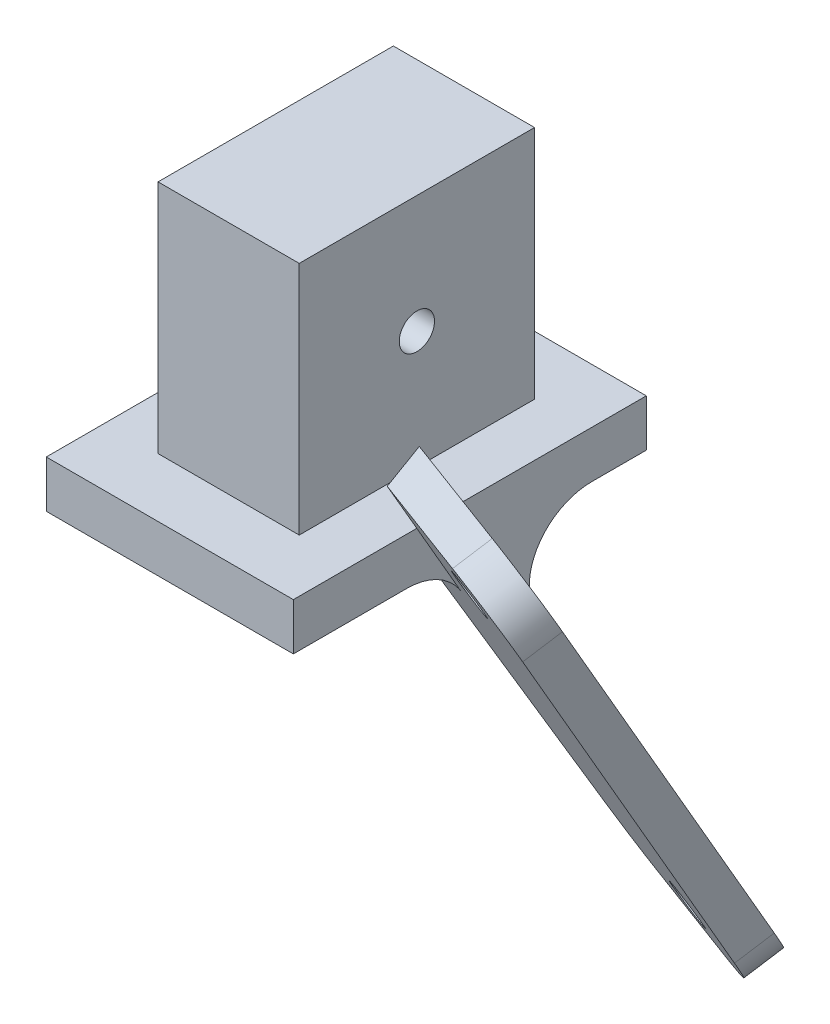
ISO-10303-21;
HEADER;
FILE_DESCRIPTION(('STEP AP214'),'2;1');
FILE_NAME('part.step','',(''),(''),'','','');
FILE_SCHEMA(('AUTOMOTIVE_DESIGN { 1 0 10303 214 1 1 1 1 }'));
ENDSEC;
DATA;
#1=APPLICATION_CONTEXT('core data for automotive mechanical design processes');
#2=APPLICATION_PROTOCOL_DEFINITION('international standard','automotive_design',2000,#1);
#3=PRODUCT_CONTEXT('',#1,'mechanical');
#4=PRODUCT('Part','Part','',(#3));
#5=PRODUCT_RELATED_PRODUCT_CATEGORY('part','',(#4));
#6=PRODUCT_DEFINITION_FORMATION('','',#4);
#7=PRODUCT_DEFINITION_CONTEXT('part definition',#1,'design');
#8=PRODUCT_DEFINITION('design','',#6,#7);
#9=PRODUCT_DEFINITION_SHAPE('','',#8);
#10=(LENGTH_UNIT() NAMED_UNIT(*) SI_UNIT(.MILLI.,.METRE.));
#11=(NAMED_UNIT(*) PLANE_ANGLE_UNIT() SI_UNIT($,.RADIAN.));
#12=(NAMED_UNIT(*) SI_UNIT($,.STERADIAN.) SOLID_ANGLE_UNIT());
#13=UNCERTAINTY_MEASURE_WITH_UNIT(LENGTH_MEASURE(1.E-05),#10,'distance_accuracy_value','');
#14=(GEOMETRIC_REPRESENTATION_CONTEXT(3) GLOBAL_UNCERTAINTY_ASSIGNED_CONTEXT((#13)) GLOBAL_UNIT_ASSIGNED_CONTEXT((#10,
#11,#12)) REPRESENTATION_CONTEXT('',''));
#15=CARTESIAN_POINT('',(0.,0.,0.));
#16=DIRECTION('',(0.,0.,1.));
#17=DIRECTION('',(1.,0.,0.));
#18=AXIS2_PLACEMENT_3D('',#15,#16,#17);
#19=CARTESIAN_POINT('',(0.,0.,0.));
#20=DIRECTION('',(0.,1.,0.));
#21=DIRECTION('',(0.,0.,1.));
#22=AXIS2_PLACEMENT_3D('',#19,#20,#21);
#23=PLANE('',#22);
#24=DIRECTION('',(0.,0.,-1.));
#25=VECTOR('',#24,1.);
#26=CARTESIAN_POINT('',(21.,0.,0.));
#27=LINE('',#26,#25);
#28=CARTESIAN_POINT('',(21.,0.,4.62668487913654));
#29=VERTEX_POINT('',#28);
#30=CARTESIAN_POINT('',(21.,0.,0.));
#31=VERTEX_POINT('',#30);
#32=EDGE_CURVE('E341',#29,#31,#27,.T.);
#33=ORIENTED_EDGE('',*,*,#32,.F.);
#34=DIRECTION('',(0.939692620785907,0.,0.342020143325673));
#35=VECTOR('',#34,1.);
#36=CARTESIAN_POINT('',(10.2155863177674,0.,0.701479304790655));
#37=LINE('',#36,#35);
#38=CARTESIAN_POINT('',(8.28828776764039,0.,0.));
#39=VERTEX_POINT('',#38);
#40=EDGE_CURVE('E423',#29,#39,#37,.F.);
#41=ORIENTED_EDGE('',*,*,#40,.T.);
#42=DIRECTION('',(-1.,0.,0.));
#43=VECTOR('',#42,1.);
#44=CARTESIAN_POINT('',(0.,0.,0.));
#45=LINE('',#44,#43);
#46=EDGE_CURVE('E329',#31,#39,#45,.T.);
#47=ORIENTED_EDGE('',*,*,#46,.F.);
#48=EDGE_LOOP('',(#33,#41,#47));
#49=FACE_BOUND('',#48,.T.);
#50=ADVANCED_FACE('F57',(#49),#23,.F.);
#51=CARTESIAN_POINT('',(21.9018797354497,9.78209952844713,19.5429186044547));
#52=DIRECTION('',(0.,-0.866025403784436,-0.500000000000004));
#53=DIRECTION('',(0.,0.500000000000004,-0.866025403784436));
#54=AXIS2_PLACEMENT_3D('',#51,#52,#53);
#55=PLANE('',#54);
#56=DIRECTION('',(0.953741925422946,-0.150313289241614,0.260350254019269));
#57=VECTOR('',#56,1.);
#58=CARTESIAN_POINT('',(21.,8.3514866403127,22.0208128126663));
#59=LINE('',#58,#57);
#60=CARTESIAN_POINT('',(21.,8.3514866403127,22.0208128126663));
#61=VERTEX_POINT('',#60);
#62=CARTESIAN_POINT('',(28.6299354033836,7.14898032637979,24.1036148448205));
#63=VERTEX_POINT('',#62);
#64=EDGE_CURVE('E252',#61,#63,#59,.T.);
#65=ORIENTED_EDGE('',*,*,#64,.T.);
#66=DIRECTION('',(-0.300626578483225,-0.476870962711477,0.825964736070553));
#67=VECTOR('',#66,1.);
#68=CARTESIAN_POINT('',(29.5318151388332,8.57959321451422,21.6257206366088));
#69=LINE('',#68,#67);
#70=CARTESIAN_POINT('',(29.5318151388332,8.57959321451422,21.6257206366088));
#71=VERTEX_POINT('',#70);
#72=EDGE_CURVE('E410',#63,#71,#69,.F.);
#73=ORIENTED_EDGE('',*,*,#72,.T.);
#74=DIRECTION('',(0.953741925422946,-0.150313289241614,0.260350254019269));
#75=VECTOR('',#74,1.);
#76=CARTESIAN_POINT('',(21.9018797354497,9.78209952844713,19.5429186044547));
#77=LINE('',#76,#75);
#78=CARTESIAN_POINT('',(21.,9.92423914286712,19.296725570511));
#79=VERTEX_POINT('',#78);
#80=EDGE_CURVE('E639',#79,#71,#77,.T.);
#81=ORIENTED_EDGE('',*,*,#80,.F.);
#82=DIRECTION('',(0.,0.500000000000004,-0.866025403784436));
#83=VECTOR('',#82,1.);
#84=CARTESIAN_POINT('',(21.,9.78209952844713,19.5429186044547));
#85=LINE('',#84,#83);
#86=EDGE_CURVE('E244',#61,#79,#85,.T.);
#87=ORIENTED_EDGE('',*,*,#86,.F.);
#88=EDGE_LOOP('',(#65,#73,#81,#87));
#89=FACE_BOUND('',#88,.T.);
#90=ADVANCED_FACE('F479',(#89),#55,.F.);
#91=CARTESIAN_POINT('',(-1.47086821116475,-2.33317474262836,4.04117719716872));
#92=DIRECTION('',(-0.300626578483225,-0.476870962711477,0.825964736070553));
#93=DIRECTION('',(0.,-0.866025403784436,-0.500000000000004));
#94=AXIS2_PLACEMENT_3D('',#91,#92,#93);
#95=PLANE('',#94);
#96=CARTESIAN_POINT('',(28.1012022506988,4.47493612945445,18.7351952555799));
#97=DIRECTION('',(-0.300626578483225,-0.476870962711477,0.825964736070553));
#98=DIRECTION('',(0.,-0.866025403784436,-0.500000000000004));
#99=AXIS2_PLACEMENT_3D('',#96,#97,#98);
#100=CIRCLE('',#99,1.8);
#101=CARTESIAN_POINT('',(28.1012022506988,2.91609040264247,17.8351952555799));
#102=VERTEX_POINT('',#101);
#103=EDGE_CURVE('E616',#102,#102,#100,.T.);
#104=ORIENTED_EDGE('',*,*,#103,.T.);
#105=EDGE_LOOP('',(#104));
#106=FACE_BOUND('',#105,.T.);
#107=CARTESIAN_POINT('',(28.1012022506988,-27.5680038105697,0.23519525557973));
#108=DIRECTION('',(-0.300626578483225,-0.476870962711477,0.825964736070553));
#109=DIRECTION('',(0.,-0.866025403784436,-0.500000000000004));
#110=AXIS2_PLACEMENT_3D('',#107,#108,#109);
#111=CIRCLE('',#110,1.8);
#112=CARTESIAN_POINT('',(28.1012022506988,-29.1268495373817,-0.664804744420277));
#113=VERTEX_POINT('',#112);
#114=EDGE_CURVE('E245',#113,#113,#111,.T.);
#115=ORIENTED_EDGE('',*,*,#114,.T.);
#116=EDGE_LOOP('',(#115));
#117=FACE_BOUND('',#116,.T.);
#118=CARTESIAN_POINT('',(12.1109458051018,-6.70516727500118,6.46038216096881));
#119=DIRECTION('',(-0.300626578483225,-0.476870962711477,0.825964736070553));
#120=DIRECTION('',(0.,-0.866025403784436,-0.500000000000004));
#121=AXIS2_PLACEMENT_3D('',#118,#119,#120);
#122=CIRCLE('',#121,5.);
#123=CARTESIAN_POINT('',(7.84568224862732,-7.96943748277321,4.17802644032607));
#124=VERTEX_POINT('',#123);
#125=CARTESIAN_POINT('',(7.59495621370452,-7.38435481355739,4.42456726322852));
#126=VERTEX_POINT('',#125);
#127=EDGE_CURVE('E392',#124,#126,#122,.F.);
#128=ORIENTED_EDGE('',*,*,#127,.T.);
#129=DIRECTION('',(0.939692620785907,0.,0.342020143325673));
#130=VECTOR('',#129,1.);
#131=CARTESIAN_POINT('',(22.3702172473642,-7.38435481355739,9.80232248299399));
#132=LINE('',#131,#130);
#133=CARTESIAN_POINT('',(21.,-7.38435481355739,9.30360419047525));
#134=VERTEX_POINT('',#133);
#135=EDGE_CURVE('E413',#126,#134,#132,.T.);
#136=ORIENTED_EDGE('',*,*,#135,.T.);
#137=DIRECTION('',(0.,0.866025403784436,0.500000000000004));
#138=VECTOR('',#137,1.);
#139=CARTESIAN_POINT('',(21.,-2.87466749124288,11.9072733799746));
#140=LINE('',#139,#138);
#141=CARTESIAN_POINT('',(21.,4.,15.8763645066329));
#142=VERTEX_POINT('',#141);
#143=EDGE_CURVE('E260',#134,#142,#140,.T.);
#144=ORIENTED_EDGE('',*,*,#143,.T.);
#145=DIRECTION('',(0.,-0.866025403784436,-0.500000000000004));
#146=VECTOR('',#145,1.);
#147=CARTESIAN_POINT('',(21.,-5.87466749124286,10.1752225724057));
#148=LINE('',#147,#146);
#149=EDGE_CURVE('E242',#79,#142,#148,.T.);
#150=ORIENTED_EDGE('',*,*,#149,.F.);
#151=ORIENTED_EDGE('',*,*,#80,.T.);
#152=CARTESIAN_POINT('',(29.5318151388332,4.24946619559204,19.1257206366088));
#153=DIRECTION('',(-0.300626578483225,-0.476870962711477,0.825964736070553));
#154=DIRECTION('',(0.,-0.866025403784436,-0.500000000000004));
#155=AXIS2_PLACEMENT_3D('',#152,#153,#154);
#156=CIRCLE('',#155,5.);
#157=CARTESIAN_POINT('',(34.300524765948,3.49789974938397,20.4274719067051));
#158=VERTEX_POINT('',#157);
#159=EDGE_CURVE('E383',#71,#158,#156,.F.);
#160=ORIENTED_EDGE('',*,*,#159,.T.);
#161=DIRECTION('',(0.,-0.866025403784436,-0.500000000000004));
#162=VECTOR('',#161,1.);
#163=CARTESIAN_POINT('',(34.300524765948,7.82802676830616,22.9274719067051));
#164=LINE('',#163,#162);
#165=CARTESIAN_POINT('',(34.300524765948,-27.6790147868557,2.42747190670498));
#166=VERTEX_POINT('',#165);
#167=EDGE_CURVE('E268',#158,#166,#164,.T.);
#168=ORIENTED_EDGE('',*,*,#167,.T.);
#169=CARTESIAN_POINT('',(29.5318151388332,-26.9274483406477,1.12572063660863));
#170=DIRECTION('',(-0.300626578483225,-0.476870962711477,0.825964736070553));
#171=DIRECTION('',(0.,-0.866025403784436,-0.500000000000004));
#172=AXIS2_PLACEMENT_3D('',#169,#170,#171);
#173=CIRCLE('',#172,5.);
#174=CARTESIAN_POINT('',(29.5318151388332,-31.2575753595698,-1.37427936339139));
#175=VERTEX_POINT('',#174);
#176=EDGE_CURVE('E386',#166,#175,#173,.F.);
#177=ORIENTED_EDGE('',*,*,#176,.T.);
#178=DIRECTION('',(-0.953741925422946,0.150313289241614,-0.260350254019268));
#179=VECTOR('',#178,1.);
#180=CARTESIAN_POINT('',(34.300524765948,-32.0091418057779,-0.0725280932950454));
#181=LINE('',#180,#179);
#182=CARTESIAN_POINT('',(21.7343639150982,-30.0286679267537,-3.50280947482801));
#183=VERTEX_POINT('',#182);
#184=EDGE_CURVE('E261',#175,#183,#181,.T.);
#185=ORIENTED_EDGE('',*,*,#184,.T.);
#186=CARTESIAN_POINT('',(21.7343639150982,-25.6985409078315,-1.00280947482799));
#187=DIRECTION('',(-0.300626578483225,-0.476870962711477,0.825964736070553));
#188=DIRECTION('',(0.,-0.866025403784436,-0.500000000000004));
#189=AXIS2_PLACEMENT_3D('',#186,#187,#188);
#190=CIRCLE('',#189,5.);
#191=CARTESIAN_POINT('',(17.4691003586237,-26.9628111156035,-3.28516519547073));
#192=VERTEX_POINT('',#191);
#193=EDGE_CURVE('E389',#183,#192,#190,.F.);
#194=ORIENTED_EDGE('',*,*,#193,.T.);
#195=DIRECTION('',(-0.426526355647448,0.841818815774649,0.330781422310677));
#196=VECTOR('',#195,1.);
#197=CARTESIAN_POINT('',(4.14633422216601,-0.668175242959792,7.04695959208309));
#198=LINE('',#197,#196);
#199=EDGE_CURVE('E518',#192,#124,#198,.T.);
#200=ORIENTED_EDGE('',*,*,#199,.T.);
#201=EDGE_LOOP('',(#128,#136,#144,#150,#151,#160,#168,#177,#185,#194,#200));
#202=FACE_BOUND('',#201,.T.);
#203=ADVANCED_FACE('F486',(#106,#117,#202),#95,.F.);
#204=CARTESIAN_POINT('',(-2.37274794661443,-3.76378763076279,6.51907140538038));
#205=DIRECTION('',(-0.300626578483225,-0.476870962711477,0.825964736070553));
#206=DIRECTION('',(0.,-0.866025403784436,-0.500000000000004));
#207=AXIS2_PLACEMENT_3D('',#204,#205,#206);
#208=PLANE('',#207);
#209=DIRECTION('',(0.,0.866025403784436,0.500000000000004));
#210=VECTOR('',#209,1.);
#211=CARTESIAN_POINT('',(21.,-4.4474199937973,14.6313606221299));
#212=LINE('',#211,#210);
#213=CARTESIAN_POINT('',(21.,-2.61564518644262,15.6889363002509));
#214=VERTEX_POINT('',#213);
#215=CARTESIAN_POINT('',(21.,4.,19.5084808295067));
#216=VERTEX_POINT('',#215);
#217=EDGE_CURVE('E250',#214,#216,#212,.T.);
#218=ORIENTED_EDGE('',*,*,#217,.F.);
#219=DIRECTION('',(0.939692620785907,0.,0.342020143325673));
#220=VECTOR('',#219,1.);
#221=CARTESIAN_POINT('',(-2.5857935842306,-2.61564518644261,7.10440948404412));
#222=LINE('',#221,#220);
#223=CARTESIAN_POINT('',(5.47377114117365,-2.61564518644261,10.0378511452332));
#224=VERTEX_POINT('',#223);
#225=EDGE_CURVE('E83',#214,#224,#222,.F.);
#226=ORIENTED_EDGE('',*,*,#225,.T.);
#227=CARTESIAN_POINT('',(1.67164681542267,-5.,7.27738317022939));
#228=DIRECTION('',(-0.300626578483225,-0.476870962711477,0.825964736070553));
#229=DIRECTION('',(0.,0.866025403784436,0.500000000000004));
#230=AXIS2_PLACEMENT_3D('',#227,#228,#229);
#231=ELLIPSE('',#230,5.70790654874848,5.);
#232=CARTESIAN_POINT('',(6.4403564425374,-5.75156644620807,8.57913444032573));
#233=VERTEX_POINT('',#232);
#234=EDGE_CURVE('E67',#224,#233,#231,.F.);
#235=ORIENTED_EDGE('',*,*,#234,.T.);
#236=DIRECTION('',(0.,0.866025403784436,0.500000000000004));
#237=VECTOR('',#236,1.);
#238=CARTESIAN_POINT('',(6.4403564425374,10.6461408386559,18.0463551553347));
#239=LINE('',#238,#237);
#240=CARTESIAN_POINT('',(6.4403564425374,-7.38421371692753,7.63652509908413));
#241=VERTEX_POINT('',#240);
#242=EDGE_CURVE('E271',#241,#233,#239,.T.);
#243=ORIENTED_EDGE('',*,*,#242,.F.);
#244=CARTESIAN_POINT('',(11.2090660696521,-8.13578016313561,8.93827636918047));
#245=DIRECTION('',(-0.300626578483225,-0.476870962711477,0.825964736070553));
#246=DIRECTION('',(0.,-0.866025403784436,-0.500000000000004));
#247=AXIS2_PLACEMENT_3D('',#244,#245,#246);
#248=CIRCLE('',#247,5.);
#249=CARTESIAN_POINT('',(6.94380251317764,-9.40005037090764,6.65592064853773));
#250=VERTEX_POINT('',#249);
#251=EDGE_CURVE('E373',#241,#250,#248,.T.);
#252=ORIENTED_EDGE('',*,*,#251,.T.);
#253=DIRECTION('',(-0.426526355647448,0.841818815774649,0.330781422310677));
#254=VECTOR('',#253,1.);
#255=CARTESIAN_POINT('',(3.24445448671633,-2.09878813109422,9.52485380029475));
#256=LINE('',#255,#254);
#257=CARTESIAN_POINT('',(16.567220623174,-28.3934240037379,-0.80727098725907));
#258=VERTEX_POINT('',#257);
#259=EDGE_CURVE('E523',#258,#250,#256,.T.);
#260=ORIENTED_EDGE('',*,*,#259,.F.);
#261=CARTESIAN_POINT('',(20.8324841796485,-27.1291537959659,1.47508473338367));
#262=DIRECTION('',(-0.300626578483225,-0.476870962711477,0.825964736070553));
#263=DIRECTION('',(0.,-0.866025403784436,-0.500000000000004));
#264=AXIS2_PLACEMENT_3D('',#261,#262,#263);
#265=CIRCLE('',#264,5.);
#266=CARTESIAN_POINT('',(20.8324841796485,-31.4592808148881,-1.02491526661635));
#267=VERTEX_POINT('',#266);
#268=EDGE_CURVE('E370',#258,#267,#265,.T.);
#269=ORIENTED_EDGE('',*,*,#268,.T.);
#270=DIRECTION('',(-0.953741925422946,0.150313289241614,-0.260350254019269));
#271=VECTOR('',#270,1.);
#272=CARTESIAN_POINT('',(6.44035644253739,-29.1910277354282,-4.95364484466546));
#273=LINE('',#272,#271);
#274=CARTESIAN_POINT('',(28.6299354033836,-32.6881882477043,1.10361484482027));
#275=VERTEX_POINT('',#274);
#276=EDGE_CURVE('E651',#275,#267,#273,.T.);
#277=ORIENTED_EDGE('',*,*,#276,.F.);
#278=CARTESIAN_POINT('',(28.6299354033836,-28.3580612287821,3.60361484482029));
#279=DIRECTION('',(-0.300626578483225,-0.476870962711477,0.825964736070553));
#280=DIRECTION('',(0.,-0.866025403784436,-0.500000000000004));
#281=AXIS2_PLACEMENT_3D('',#278,#279,#280);
#282=CIRCLE('',#281,5.);
#283=CARTESIAN_POINT('',(33.3986450304983,-29.1096276749902,4.90536611491663));
#284=VERTEX_POINT('',#283);
#285=EDGE_CURVE('E367',#275,#284,#282,.T.);
#286=ORIENTED_EDGE('',*,*,#285,.T.);
#287=DIRECTION('',(0.,-0.866025403784436,-0.500000000000004));
#288=VECTOR('',#287,1.);
#289=CARTESIAN_POINT('',(33.3986450304983,6.39741388017172,25.4053661149168));
#290=LINE('',#289,#288);
#291=CARTESIAN_POINT('',(33.3986450304983,2.06728686124954,22.9053661149168));
#292=VERTEX_POINT('',#291);
#293=EDGE_CURVE('E648',#292,#284,#290,.T.);
#294=ORIENTED_EDGE('',*,*,#293,.F.);
#295=CARTESIAN_POINT('',(28.6299354033836,2.81885330745761,21.6036148448204));
#296=DIRECTION('',(-0.300626578483225,-0.476870962711477,0.825964736070553));
#297=DIRECTION('',(0.,-0.866025403784436,-0.500000000000004));
#298=AXIS2_PLACEMENT_3D('',#295,#296,#297);
#299=CIRCLE('',#298,5.);
#300=EDGE_CURVE('E364',#292,#63,#299,.T.);
#301=ORIENTED_EDGE('',*,*,#300,.T.);
#302=ORIENTED_EDGE('',*,*,#64,.F.);
#303=DIRECTION('',(0.,-0.866025403784436,-0.500000000000004));
#304=VECTOR('',#303,1.);
#305=CARTESIAN_POINT('',(21.,-7.44741999379728,12.899309814561));
#306=LINE('',#305,#304);
#307=EDGE_CURVE('E239',#61,#216,#306,.T.);
#308=ORIENTED_EDGE('',*,*,#307,.T.);
#309=EDGE_LOOP('',(#218,#226,#235,#243,#252,#260,#269,#277,#286,#294,#301,#302,#308));
#310=FACE_BOUND('',#309,.T.);
#311=CARTESIAN_POINT('',(27.1993225152491,3.04432324132002,21.2130894637916));
#312=DIRECTION('',(-0.300626578483225,-0.476870962711477,0.825964736070553));
#313=DIRECTION('',(0.,-0.866025403784436,-0.500000000000004));
#314=AXIS2_PLACEMENT_3D('',#311,#312,#313);
#315=CIRCLE('',#314,1.8);
#316=CARTESIAN_POINT('',(27.1993225152491,1.48547751450804,20.3130894637915));
#317=VERTEX_POINT('',#316);
#318=EDGE_CURVE('E619',#317,#317,#315,.T.);
#319=ORIENTED_EDGE('',*,*,#318,.F.);
#320=EDGE_LOOP('',(#319));
#321=FACE_BOUND('',#320,.T.);
#322=CARTESIAN_POINT('',(27.1993225152491,-28.9986166987041,2.71308946379139));
#323=DIRECTION('',(-0.300626578483225,-0.476870962711477,0.825964736070553));
#324=DIRECTION('',(0.,-0.866025403784436,-0.500000000000004));
#325=AXIS2_PLACEMENT_3D('',#322,#323,#324);
#326=CIRCLE('',#325,1.8);
#327=CARTESIAN_POINT('',(27.1993225152491,-30.5574624255161,1.81308946379138));
#328=VERTEX_POINT('',#327);
#329=EDGE_CURVE('E621',#328,#328,#326,.T.);
#330=ORIENTED_EDGE('',*,*,#329,.F.);
#331=EDGE_LOOP('',(#330));
#332=FACE_BOUND('',#331,.T.);
#333=ADVANCED_FACE('F248',(#310,#321,#332),#208,.T.);
#334=CARTESIAN_POINT('',(21.,4.,0.));
#335=DIRECTION('',(-1.,0.,0.));
#336=DIRECTION('',(0.,0.,1.));
#337=AXIS2_PLACEMENT_3D('',#334,#335,#336);
#338=PLANE('',#337);
#339=ORIENTED_EDGE('',*,*,#143,.F.);
#340=CARTESIAN_POINT('',(21.,-5.,4.62668487913654));
#341=DIRECTION('',(-1.,0.,0.));
#342=DIRECTION('',(0.,0.,-1.));
#343=AXIS2_PLACEMENT_3D('',#340,#341,#342);
#344=ELLIPSE('',#343,5.32088886237957,5.);
#345=EDGE_CURVE('E431',#134,#29,#344,.T.);
#346=ORIENTED_EDGE('',*,*,#345,.T.);
#347=ORIENTED_EDGE('',*,*,#32,.T.);
#348=DIRECTION('',(0.,-1.,0.));
#349=VECTOR('',#348,1.);
#350=CARTESIAN_POINT('',(21.,4.,0.));
#351=LINE('',#350,#349);
#352=CARTESIAN_POINT('',(21.,4.,0.));
#353=VERTEX_POINT('',#352);
#354=EDGE_CURVE('E352',#353,#31,#351,.T.);
#355=ORIENTED_EDGE('',*,*,#354,.F.);
#356=DIRECTION('',(0.,0.,-1.));
#357=VECTOR('',#356,1.);
#358=CARTESIAN_POINT('',(21.,4.,0.));
#359=LINE('',#358,#357);
#360=EDGE_CURVE('E234',#142,#353,#359,.T.);
#361=ORIENTED_EDGE('',*,*,#360,.F.);
#362=EDGE_LOOP('',(#339,#346,#347,#355,#361));
#363=FACE_BOUND('',#362,.T.);
#364=ADVANCED_FACE('F501',(#363),#338,.F.);
#365=CARTESIAN_POINT('',(0.,4.,0.));
#366=DIRECTION('',(0.,1.,0.));
#367=DIRECTION('',(0.,0.,1.));
#368=AXIS2_PLACEMENT_3D('',#365,#366,#367);
#369=PLANE('',#368);
#370=DIRECTION('',(-1.,0.,0.));
#371=VECTOR('',#370,1.);
#372=CARTESIAN_POINT('',(4.5,4.,5.));
#373=LINE('',#372,#371);
#374=CARTESIAN_POINT('',(16.5,4.,5.));
#375=VERTEX_POINT('',#374);
#376=CARTESIAN_POINT('',(4.5,4.,5.));
#377=VERTEX_POINT('',#376);
#378=EDGE_CURVE('E287',#375,#377,#373,.T.);
#379=ORIENTED_EDGE('',*,*,#378,.F.);
#380=DIRECTION('',(0.,0.,-1.));
#381=VECTOR('',#380,1.);
#382=CARTESIAN_POINT('',(16.5,4.,5.));
#383=LINE('',#382,#381);
#384=CARTESIAN_POINT('',(16.5,4.,25.));
#385=VERTEX_POINT('',#384);
#386=EDGE_CURVE('E304',#385,#375,#383,.T.);
#387=ORIENTED_EDGE('',*,*,#386,.F.);
#388=DIRECTION('',(1.,0.,0.));
#389=VECTOR('',#388,1.);
#390=CARTESIAN_POINT('',(4.5,4.,25.));
#391=LINE('',#390,#389);
#392=CARTESIAN_POINT('',(4.5,4.,25.));
#393=VERTEX_POINT('',#392);
#394=EDGE_CURVE('E300',#393,#385,#391,.T.);
#395=ORIENTED_EDGE('',*,*,#394,.F.);
#396=DIRECTION('',(0.,0.,1.));
#397=VECTOR('',#396,1.);
#398=CARTESIAN_POINT('',(4.5,4.,5.));
#399=LINE('',#398,#397);
#400=EDGE_CURVE('E278',#377,#393,#399,.T.);
#401=ORIENTED_EDGE('',*,*,#400,.F.);
#402=EDGE_LOOP('',(#379,#387,#395,#401));
#403=FACE_BOUND('',#402,.T.);
#404=ORIENTED_EDGE('',*,*,#360,.T.);
#405=DIRECTION('',(-1.,0.,0.));
#406=VECTOR('',#405,1.);
#407=CARTESIAN_POINT('',(0.,4.,0.));
#408=LINE('',#407,#406);
#409=CARTESIAN_POINT('',(0.,4.,0.));
#410=VERTEX_POINT('',#409);
#411=EDGE_CURVE('E233',#353,#410,#408,.T.);
#412=ORIENTED_EDGE('',*,*,#411,.T.);
#413=DIRECTION('',(0.,0.,1.));
#414=VECTOR('',#413,1.);
#415=CARTESIAN_POINT('',(0.,4.,0.));
#416=LINE('',#415,#414);
#417=CARTESIAN_POINT('',(0.,4.,30.));
#418=VERTEX_POINT('',#417);
#419=EDGE_CURVE('E326',#410,#418,#416,.T.);
#420=ORIENTED_EDGE('',*,*,#419,.T.);
#421=DIRECTION('',(1.,0.,0.));
#422=VECTOR('',#421,1.);
#423=CARTESIAN_POINT('',(0.,4.,30.));
#424=LINE('',#423,#422);
#425=CARTESIAN_POINT('',(21.,4.,30.));
#426=VERTEX_POINT('',#425);
#427=EDGE_CURVE('E227',#418,#426,#424,.T.);
#428=ORIENTED_EDGE('',*,*,#427,.T.);
#429=EDGE_CURVE('E221',#426,#216,#359,.T.);
#430=ORIENTED_EDGE('',*,*,#429,.T.);
#431=DIRECTION('',(0.,0.,-1.));
#432=VECTOR('',#431,1.);
#433=CARTESIAN_POINT('',(21.,4.,23.5414123331734));
#434=LINE('',#433,#432);
#435=EDGE_CURVE('E224',#216,#142,#434,.T.);
#436=ORIENTED_EDGE('',*,*,#435,.T.);
#437=EDGE_LOOP('',(#404,#412,#420,#428,#430,#436));
#438=FACE_BOUND('',#437,.T.);
#439=ADVANCED_FACE('F223',(#403,#438),#369,.T.);
#440=CARTESIAN_POINT('',(3.65820995840766,0.,0.));
#441=VERTEX_POINT('',#440);
#442=CARTESIAN_POINT('',(0.,0.,0.));
#443=VERTEX_POINT('',#442);
#444=EDGE_CURVE('E345',#441,#443,#45,.T.);
#445=ORIENTED_EDGE('',*,*,#444,.F.);
#446=DIRECTION('',(0.263342239326904,0.,-0.964702474852372));
#447=VECTOR('',#446,1.);
#448=CARTESIAN_POINT('',(0.828041260088058,0.,10.3677661225071));
#449=LINE('',#448,#447);
#450=CARTESIAN_POINT('',(0.16851392300654,0.,12.7838147440331));
#451=VERTEX_POINT('',#450);
#452=EDGE_CURVE('E420',#441,#451,#449,.F.);
#453=ORIENTED_EDGE('',*,*,#452,.T.);
#454=DIRECTION('',(0.939692620785907,0.,0.342020143325673));
#455=VECTOR('',#454,1.);
#456=CARTESIAN_POINT('',(-4.08892647664673,0.,11.2342331643969));
#457=LINE('',#456,#455);
#458=CARTESIAN_POINT('',(21.,0.,20.3658556115896));
#459=VERTEX_POINT('',#458);
#460=EDGE_CURVE('E417',#451,#459,#457,.T.);
#461=ORIENTED_EDGE('',*,*,#460,.T.);
#462=CARTESIAN_POINT('',(21.,0.,30.));
#463=VERTEX_POINT('',#462);
#464=EDGE_CURVE('E342',#463,#459,#27,.T.);
#465=ORIENTED_EDGE('',*,*,#464,.F.);
#466=DIRECTION('',(1.,0.,0.));
#467=VECTOR('',#466,1.);
#468=CARTESIAN_POINT('',(0.,0.,30.));
#469=LINE('',#468,#467);
#470=CARTESIAN_POINT('',(0.,0.,30.));
#471=VERTEX_POINT('',#470);
#472=EDGE_CURVE('E338',#471,#463,#469,.T.);
#473=ORIENTED_EDGE('',*,*,#472,.F.);
#474=DIRECTION('',(0.,0.,1.));
#475=VECTOR('',#474,1.);
#476=CARTESIAN_POINT('',(0.,0.,0.));
#477=LINE('',#476,#475);
#478=EDGE_CURVE('E325',#443,#471,#477,.T.);
#479=ORIENTED_EDGE('',*,*,#478,.F.);
#480=EDGE_LOOP('',(#445,#453,#461,#465,#473,#479));
#481=FACE_BOUND('',#480,.T.);
#482=ADVANCED_FACE('F482',(#481),#23,.F.);
#483=CARTESIAN_POINT('',(16.5,24.,5.));
#484=DIRECTION('',(-1.,0.,0.));
#485=DIRECTION('',(0.,0.,1.));
#486=AXIS2_PLACEMENT_3D('',#483,#484,#485);
#487=PLANE('',#486);
#488=ORIENTED_EDGE('',*,*,#386,.T.);
#489=DIRECTION('',(0.,-1.,0.));
#490=VECTOR('',#489,1.);
#491=CARTESIAN_POINT('',(16.5,24.,5.));
#492=LINE('',#491,#490);
#493=CARTESIAN_POINT('',(16.5,24.,5.));
#494=VERTEX_POINT('',#493);
#495=EDGE_CURVE('E313',#494,#375,#492,.T.);
#496=ORIENTED_EDGE('',*,*,#495,.F.);
#497=DIRECTION('',(0.,0.,-1.));
#498=VECTOR('',#497,1.);
#499=CARTESIAN_POINT('',(16.5,24.,5.));
#500=LINE('',#499,#498);
#501=CARTESIAN_POINT('',(16.5,24.,25.));
#502=VERTEX_POINT('',#501);
#503=EDGE_CURVE('E290',#502,#494,#500,.T.);
#504=ORIENTED_EDGE('',*,*,#503,.F.);
#505=DIRECTION('',(0.,-1.,0.));
#506=VECTOR('',#505,1.);
#507=CARTESIAN_POINT('',(16.5,24.,25.));
#508=LINE('',#507,#506);
#509=EDGE_CURVE('E317',#502,#385,#508,.T.);
#510=ORIENTED_EDGE('',*,*,#509,.T.);
#511=EDGE_LOOP('',(#488,#496,#504,#510));
#512=FACE_BOUND('',#511,.T.);
#513=CARTESIAN_POINT('',(16.5,14.,15.));
#514=DIRECTION('',(1.,0.,0.));
#515=DIRECTION('',(0.,0.,-1.));
#516=AXIS2_PLACEMENT_3D('',#513,#514,#515);
#517=CIRCLE('',#516,1.5);
#518=CARTESIAN_POINT('',(16.5,14.,13.5));
#519=VERTEX_POINT('',#518);
#520=EDGE_CURVE('E265',#519,#519,#517,.T.);
#521=ORIENTED_EDGE('',*,*,#520,.F.);
#522=EDGE_LOOP('',(#521));
#523=FACE_BOUND('',#522,.T.);
#524=ADVANCED_FACE('F493',(#512,#523),#487,.F.);
#525=CARTESIAN_POINT('',(0.,4.,0.));
#526=DIRECTION('',(1.,0.,0.));
#527=DIRECTION('',(0.,0.,-1.));
#528=AXIS2_PLACEMENT_3D('',#525,#526,#527);
#529=PLANE('',#528);
#530=ORIENTED_EDGE('',*,*,#478,.T.);
#531=DIRECTION('',(0.,-1.,0.));
#532=VECTOR('',#531,1.);
#533=CARTESIAN_POINT('',(0.,4.,30.));
#534=LINE('',#533,#532);
#535=EDGE_CURVE('E254',#418,#471,#534,.T.);
#536=ORIENTED_EDGE('',*,*,#535,.F.);
#537=ORIENTED_EDGE('',*,*,#419,.F.);
#538=DIRECTION('',(0.,-1.,0.));
#539=VECTOR('',#538,1.);
#540=CARTESIAN_POINT('',(0.,4.,0.));
#541=LINE('',#540,#539);
#542=EDGE_CURVE('E334',#410,#443,#541,.T.);
#543=ORIENTED_EDGE('',*,*,#542,.T.);
#544=EDGE_LOOP('',(#530,#536,#537,#543));
#545=FACE_BOUND('',#544,.T.);
#546=ADVANCED_FACE('F461',(#545),#529,.F.);
#547=CARTESIAN_POINT('',(0.,4.,30.));
#548=DIRECTION('',(0.,0.,-1.));
#549=DIRECTION('',(-1.,0.,0.));
#550=AXIS2_PLACEMENT_3D('',#547,#548,#549);
#551=PLANE('',#550);
#552=ORIENTED_EDGE('',*,*,#472,.T.);
#553=DIRECTION('',(0.,-1.,0.));
#554=VECTOR('',#553,1.);
#555=CARTESIAN_POINT('',(21.,4.,30.));
#556=LINE('',#555,#554);
#557=EDGE_CURVE('E356',#426,#463,#556,.T.);
#558=ORIENTED_EDGE('',*,*,#557,.F.);
#559=ORIENTED_EDGE('',*,*,#427,.F.);
#560=ORIENTED_EDGE('',*,*,#535,.T.);
#561=EDGE_LOOP('',(#552,#558,#559,#560));
#562=FACE_BOUND('',#561,.T.);
#563=ADVANCED_FACE('F547',(#562),#551,.F.);
#564=ORIENTED_EDGE('',*,*,#464,.T.);
#565=CARTESIAN_POINT('',(21.,-5.,20.3658556115896));
#566=DIRECTION('',(-1.,0.,0.));
#567=DIRECTION('',(0.,0.,1.));
#568=AXIS2_PLACEMENT_3D('',#565,#566,#567);
#569=ELLIPSE('',#568,5.32088886237957,5.);
#570=EDGE_CURVE('E12',#459,#214,#569,.T.);
#571=ORIENTED_EDGE('',*,*,#570,.T.);
#572=ORIENTED_EDGE('',*,*,#217,.T.);
#573=ORIENTED_EDGE('',*,*,#429,.F.);
#574=ORIENTED_EDGE('',*,*,#557,.T.);
#575=EDGE_LOOP('',(#564,#571,#572,#573,#574));
#576=FACE_BOUND('',#575,.T.);
#577=ADVANCED_FACE('F257',(#576),#338,.F.);
#578=CARTESIAN_POINT('',(0.,4.,0.));
#579=DIRECTION('',(0.,0.,1.));
#580=DIRECTION('',(1.,0.,0.));
#581=AXIS2_PLACEMENT_3D('',#578,#579,#580);
#582=PLANE('',#581);
#583=ORIENTED_EDGE('',*,*,#46,.T.);
#584=CARTESIAN_POINT('',(8.28828776764038,-5.,0.));
#585=DIRECTION('',(0.,0.,1.));
#586=DIRECTION('',(-1.,0.,0.));
#587=AXIS2_PLACEMENT_3D('',#584,#585,#586);
#588=ELLIPSE('',#587,14.6190220008153,5.);
#589=CARTESIAN_POINT('',(4.87008144046005,-0.138599388678797,0.));
#590=VERTEX_POINT('',#589);
#591=EDGE_CURVE('E434',#39,#590,#588,.T.);
#592=ORIENTED_EDGE('',*,*,#591,.T.);
#593=CARTESIAN_POINT('',(3.65820995840766,-5.,0.));
#594=DIRECTION('',(0.,0.,1.));
#595=DIRECTION('',(-1.,0.,0.));
#596=AXIS2_PLACEMENT_3D('',#593,#594,#595);
#597=ELLIPSE('',#596,5.18294513628686,5.);
#598=EDGE_CURVE('E449',#590,#441,#597,.T.);
#599=ORIENTED_EDGE('',*,*,#598,.T.);
#600=ORIENTED_EDGE('',*,*,#444,.T.);
#601=ORIENTED_EDGE('',*,*,#542,.F.);
#602=ORIENTED_EDGE('',*,*,#411,.F.);
#603=ORIENTED_EDGE('',*,*,#354,.T.);
#604=EDGE_LOOP('',(#583,#592,#599,#600,#601,#602,#603));
#605=FACE_BOUND('',#604,.T.);
#606=ADVANCED_FACE('F532',(#605),#582,.F.);
#607=CARTESIAN_POINT('',(4.5,24.,5.));
#608=DIRECTION('',(1.,0.,0.));
#609=DIRECTION('',(0.,0.,-1.));
#610=AXIS2_PLACEMENT_3D('',#607,#608,#609);
#611=PLANE('',#610);
#612=CARTESIAN_POINT('',(4.5,14.,15.));
#613=DIRECTION('',(1.,0.,0.));
#614=DIRECTION('',(0.,0.,-1.));
#615=AXIS2_PLACEMENT_3D('',#612,#613,#614);
#616=CIRCLE('',#615,1.5);
#617=CARTESIAN_POINT('',(4.5,14.,13.5));
#618=VERTEX_POINT('',#617);
#619=EDGE_CURVE('E274',#618,#618,#616,.T.);
#620=ORIENTED_EDGE('',*,*,#619,.T.);
#621=EDGE_LOOP('',(#620));
#622=FACE_BOUND('',#621,.T.);
#623=ORIENTED_EDGE('',*,*,#400,.T.);
#624=DIRECTION('',(0.,-1.,0.));
#625=VECTOR('',#624,1.);
#626=CARTESIAN_POINT('',(4.5,24.,25.));
#627=LINE('',#626,#625);
#628=CARTESIAN_POINT('',(4.5,24.,25.));
#629=VERTEX_POINT('',#628);
#630=EDGE_CURVE('E321',#629,#393,#627,.T.);
#631=ORIENTED_EDGE('',*,*,#630,.F.);
#632=DIRECTION('',(0.,0.,1.));
#633=VECTOR('',#632,1.);
#634=CARTESIAN_POINT('',(4.5,24.,5.));
#635=LINE('',#634,#633);
#636=CARTESIAN_POINT('',(4.5,24.,5.));
#637=VERTEX_POINT('',#636);
#638=EDGE_CURVE('E282',#637,#629,#635,.T.);
#639=ORIENTED_EDGE('',*,*,#638,.F.);
#640=DIRECTION('',(0.,-1.,0.));
#641=VECTOR('',#640,1.);
#642=CARTESIAN_POINT('',(4.5,24.,5.));
#643=LINE('',#642,#641);
#644=EDGE_CURVE('E296',#637,#377,#643,.T.);
#645=ORIENTED_EDGE('',*,*,#644,.T.);
#646=EDGE_LOOP('',(#623,#631,#639,#645));
#647=FACE_BOUND('',#646,.T.);
#648=ADVANCED_FACE('F556',(#622,#647),#611,.F.);
#649=CARTESIAN_POINT('',(4.5,24.,25.));
#650=DIRECTION('',(0.,0.,-1.));
#651=DIRECTION('',(-1.,0.,0.));
#652=AXIS2_PLACEMENT_3D('',#649,#650,#651);
#653=PLANE('',#652);
#654=ORIENTED_EDGE('',*,*,#394,.T.);
#655=ORIENTED_EDGE('',*,*,#509,.F.);
#656=DIRECTION('',(1.,0.,0.));
#657=VECTOR('',#656,1.);
#658=CARTESIAN_POINT('',(4.5,24.,25.));
#659=LINE('',#658,#657);
#660=EDGE_CURVE('E286',#629,#502,#659,.T.);
#661=ORIENTED_EDGE('',*,*,#660,.F.);
#662=ORIENTED_EDGE('',*,*,#630,.T.);
#663=EDGE_LOOP('',(#654,#655,#661,#662));
#664=FACE_BOUND('',#663,.T.);
#665=ADVANCED_FACE('F560',(#664),#653,.F.);
#666=CARTESIAN_POINT('',(4.5,24.,5.));
#667=DIRECTION('',(0.,0.,1.));
#668=DIRECTION('',(1.,0.,0.));
#669=AXIS2_PLACEMENT_3D('',#666,#667,#668);
#670=PLANE('',#669);
#671=ORIENTED_EDGE('',*,*,#378,.T.);
#672=ORIENTED_EDGE('',*,*,#644,.F.);
#673=DIRECTION('',(-1.,0.,0.));
#674=VECTOR('',#673,1.);
#675=CARTESIAN_POINT('',(4.5,24.,5.));
#676=LINE('',#675,#674);
#677=EDGE_CURVE('E293',#494,#637,#676,.T.);
#678=ORIENTED_EDGE('',*,*,#677,.F.);
#679=ORIENTED_EDGE('',*,*,#495,.T.);
#680=EDGE_LOOP('',(#671,#672,#678,#679));
#681=FACE_BOUND('',#680,.T.);
#682=ADVANCED_FACE('F566',(#681),#670,.F.);
#683=CARTESIAN_POINT('',(0.,24.,0.));
#684=DIRECTION('',(0.,1.,0.));
#685=DIRECTION('',(0.,0.,1.));
#686=AXIS2_PLACEMENT_3D('',#683,#684,#685);
#687=PLANE('',#686);
#688=ORIENTED_EDGE('',*,*,#638,.T.);
#689=ORIENTED_EDGE('',*,*,#660,.T.);
#690=ORIENTED_EDGE('',*,*,#503,.T.);
#691=ORIENTED_EDGE('',*,*,#677,.T.);
#692=EDGE_LOOP('',(#688,#689,#690,#691));
#693=FACE_BOUND('',#692,.T.);
#694=ADVANCED_FACE('F573',(#693),#687,.T.);
#695=CARTESIAN_POINT('',(4.5,14.,15.));
#696=DIRECTION('',(1.,0.,0.));
#697=DIRECTION('',(0.,0.,-1.));
#698=AXIS2_PLACEMENT_3D('',#695,#696,#697);
#699=CYLINDRICAL_SURFACE('',#698,1.5);
#700=ORIENTED_EDGE('',*,*,#619,.F.);
#701=EDGE_LOOP('',(#700));
#702=FACE_BOUND('',#701,.T.);
#703=ORIENTED_EDGE('',*,*,#520,.T.);
#704=EDGE_LOOP('',(#703));
#705=FACE_BOUND('',#704,.T.);
#706=ADVANCED_FACE('F577',(#702,#705),#699,.F.);
#707=CARTESIAN_POINT('',(7.34223617798708,12.0767537267903,15.5684609471231));
#708=DIRECTION('',(0.953741925422946,-0.150313289241614,0.260350254019269));
#709=DIRECTION('',(0.263342239326904,0.,-0.964702474852372));
#710=AXIS2_PLACEMENT_3D('',#707,#708,#709);
#711=PLANE('',#710);
#712=ORIENTED_EDGE('',*,*,#242,.T.);
#713=DIRECTION('',(0.263342239326904,0.,-0.964702474852372));
#714=VECTOR('',#713,1.);
#715=CARTESIAN_POINT('',(6.49863062265247,-5.75156644620807,8.36565844832123));
#716=LINE('',#715,#714);
#717=CARTESIAN_POINT('',(7.43142182392243,-5.75156644620807,4.94856143158102));
#718=VERTEX_POINT('',#717);
#719=EDGE_CURVE('E426',#233,#718,#716,.T.);
#720=ORIENTED_EDGE('',*,*,#719,.T.);
#721=CARTESIAN_POINT('',(8.8453690704032,-5.,0.202761012271908));
#722=DIRECTION('',(0.953741925422946,-0.150313289241614,0.260350254019269));
#723=DIRECTION('',(0.,-0.866025403784437,-0.500000000000004));
#724=AXIS2_PLACEMENT_3D('',#721,#722,#723);
#725=ELLIPSE('',#724,5.0747547885674,5.);
#726=CARTESIAN_POINT('',(7.42412021247369,-5.82371172000789,4.93365635510664));
#727=VERTEX_POINT('',#726);
#728=EDGE_CURVE('E437',#718,#727,#725,.T.);
#729=ORIENTED_EDGE('',*,*,#728,.T.);
#730=DIRECTION('',(-0.300626578483225,-0.476870962711477,0.825964736070553));
#731=VECTOR('',#730,1.);
#732=CARTESIAN_POINT('',(7.34223617798707,-5.95360082879311,5.15863089087247));
#733=LINE('',#732,#731);
#734=EDGE_CURVE('E75',#727,#241,#733,.T.);
#735=ORIENTED_EDGE('',*,*,#734,.T.);
#736=EDGE_LOOP('',(#712,#720,#729,#735));
#737=FACE_BOUND('',#736,.T.);
#738=ADVANCED_FACE('F580',(#737),#711,.F.);
#739=CARTESIAN_POINT('',(34.300524765948,7.82802676830616,22.9274719067051));
#740=DIRECTION('',(-0.953741925422946,0.150313289241614,-0.260350254019269));
#741=DIRECTION('',(-0.263342239326904,0.,0.964702474852372));
#742=AXIS2_PLACEMENT_3D('',#739,#740,#741);
#743=PLANE('',#742);
#744=ORIENTED_EDGE('',*,*,#293,.T.);
#745=DIRECTION('',(-0.300626578483225,-0.476870962711477,0.825964736070553));
#746=VECTOR('',#745,1.);
#747=CARTESIAN_POINT('',(34.300524765948,-27.6790147868557,2.42747190670497));
#748=LINE('',#747,#746);
#749=EDGE_CURVE('E407',#284,#166,#748,.F.);
#750=ORIENTED_EDGE('',*,*,#749,.T.);
#751=ORIENTED_EDGE('',*,*,#167,.F.);
#752=DIRECTION('',(-0.300626578483225,-0.476870962711477,0.825964736070553));
#753=VECTOR('',#752,1.);
#754=CARTESIAN_POINT('',(34.300524765948,3.49789974938397,20.4274719067051));
#755=LINE('',#754,#753);
#756=EDGE_CURVE('E403',#158,#292,#755,.T.);
#757=ORIENTED_EDGE('',*,*,#756,.T.);
#758=EDGE_LOOP('',(#744,#750,#751,#757));
#759=FACE_BOUND('',#758,.T.);
#760=ADVANCED_FACE('F583',(#759),#743,.F.);
#761=CARTESIAN_POINT('',(7.34223617798707,-27.7604148472937,-7.43153905287712));
#762=DIRECTION('',(0.,0.866025403784436,0.500000000000004));
#763=DIRECTION('',(0.,-0.500000000000004,0.866025403784436));
#764=AXIS2_PLACEMENT_3D('',#761,#762,#763);
#765=PLANE('',#764);
#766=ORIENTED_EDGE('',*,*,#276,.T.);
#767=DIRECTION('',(-0.300626578483225,-0.476870962711477,0.825964736070553));
#768=VECTOR('',#767,1.);
#769=CARTESIAN_POINT('',(21.7343639150982,-30.0286679267537,-3.50280947482801));
#770=LINE('',#769,#768);
#771=EDGE_CURVE('E400',#267,#183,#770,.F.);
#772=ORIENTED_EDGE('',*,*,#771,.T.);
#773=ORIENTED_EDGE('',*,*,#184,.F.);
#774=DIRECTION('',(-0.300626578483225,-0.476870962711477,0.825964736070553));
#775=VECTOR('',#774,1.);
#776=CARTESIAN_POINT('',(29.5318151388332,-31.2575753595698,-1.37427936339139));
#777=LINE('',#776,#775);
#778=EDGE_CURVE('E396',#175,#275,#777,.T.);
#779=ORIENTED_EDGE('',*,*,#778,.T.);
#780=EDGE_LOOP('',(#766,#772,#773,#779));
#781=FACE_BOUND('',#780,.T.);
#782=ADVANCED_FACE('F586',(#781),#765,.F.);
#783=CARTESIAN_POINT('',(21.,14.,23.5414123331734));
#784=DIRECTION('',(-1.,0.,0.));
#785=DIRECTION('',(0.,0.,1.));
#786=AXIS2_PLACEMENT_3D('',#783,#784,#785);
#787=PLANE('',#786);
#788=ORIENTED_EDGE('',*,*,#149,.T.);
#789=ORIENTED_EDGE('',*,*,#435,.F.);
#790=ORIENTED_EDGE('',*,*,#307,.F.);
#791=ORIENTED_EDGE('',*,*,#86,.T.);
#792=EDGE_LOOP('',(#788,#789,#790,#791));
#793=FACE_BOUND('',#792,.T.);
#794=ADVANCED_FACE('F238',(#793),#787,.T.);
#795=CARTESIAN_POINT('',(4.14633422216601,-0.668175242959792,7.04695959208309));
#796=DIRECTION('',(0.853052711294897,0.252854041554406,0.45647114412855));
#797=DIRECTION('',(0.471802636914221,0.,-0.881704186108236));
#798=AXIS2_PLACEMENT_3D('',#795,#796,#797);
#799=PLANE('',#798);
#800=ORIENTED_EDGE('',*,*,#259,.T.);
#801=DIRECTION('',(-0.300626578483225,-0.476870962711477,0.825964736070553));
#802=VECTOR('',#801,1.);
#803=CARTESIAN_POINT('',(7.84568224862732,-7.96943748277321,4.17802644032607));
#804=LINE('',#803,#802);
#805=EDGE_CURVE('E380',#250,#124,#804,.F.);
#806=ORIENTED_EDGE('',*,*,#805,.T.);
#807=ORIENTED_EDGE('',*,*,#199,.F.);
#808=DIRECTION('',(-0.300626578483225,-0.476870962711477,0.825964736070553));
#809=VECTOR('',#808,1.);
#810=CARTESIAN_POINT('',(17.4691003586237,-26.9628111156035,-3.28516519547073));
#811=LINE('',#810,#809);
#812=EDGE_CURVE('E376',#192,#258,#811,.T.);
#813=ORIENTED_EDGE('',*,*,#812,.T.);
#814=EDGE_LOOP('',(#800,#806,#807,#813));
#815=FACE_BOUND('',#814,.T.);
#816=ADVANCED_FACE('F601',(#815),#799,.F.);
#817=CARTESIAN_POINT('',(28.1012022506988,-27.5680038105697,0.23519525557973));
#818=DIRECTION('',(-0.300626578483225,-0.476870962711477,0.825964736070553));
#819=DIRECTION('',(0.,-0.866025403784436,-0.500000000000004));
#820=AXIS2_PLACEMENT_3D('',#817,#818,#819);
#821=CYLINDRICAL_SURFACE('',#820,1.8);
#822=ORIENTED_EDGE('',*,*,#114,.F.);
#823=EDGE_LOOP('',(#822));
#824=FACE_BOUND('',#823,.T.);
#825=ORIENTED_EDGE('',*,*,#329,.T.);
#826=EDGE_LOOP('',(#825));
#827=FACE_BOUND('',#826,.T.);
#828=ADVANCED_FACE('F602',(#824,#827),#821,.F.);
#829=CARTESIAN_POINT('',(28.1012022506988,4.47493612945445,18.7351952555799));
#830=DIRECTION('',(-0.300626578483225,-0.476870962711477,0.825964736070553));
#831=DIRECTION('',(0.,-0.866025403784436,-0.500000000000004));
#832=AXIS2_PLACEMENT_3D('',#829,#830,#831);
#833=CYLINDRICAL_SURFACE('',#832,1.8);
#834=ORIENTED_EDGE('',*,*,#103,.F.);
#835=EDGE_LOOP('',(#834));
#836=FACE_BOUND('',#835,.T.);
#837=ORIENTED_EDGE('',*,*,#318,.T.);
#838=EDGE_LOOP('',(#837));
#839=FACE_BOUND('',#838,.T.);
#840=ADVANCED_FACE('F460',(#836,#839),#833,.F.);
#841=CARTESIAN_POINT('',(12.1109458051018,-6.70516727500118,6.46038216096881));
#842=DIRECTION('',(-0.300626578483225,-0.476870962711477,0.825964736070553));
#843=DIRECTION('',(0.,-0.866025403784436,-0.500000000000004));
#844=AXIS2_PLACEMENT_3D('',#841,#842,#843);
#845=CYLINDRICAL_SURFACE('',#844,5.);
#846=ORIENTED_EDGE('',*,*,#127,.F.);
#847=ORIENTED_EDGE('',*,*,#805,.F.);
#848=ORIENTED_EDGE('',*,*,#251,.F.);
#849=ORIENTED_EDGE('',*,*,#734,.F.);
#850=CARTESIAN_POINT('',(7.42412021247369,-5.82371172000789,4.93365635510664));
#851=CARTESIAN_POINT('',(7.41414522902547,-5.92403124799617,4.9122136263007));
#852=CARTESIAN_POINT('',(7.40777389495695,-6.02429241036955,4.88870731250555));
#853=CARTESIAN_POINT('',(7.40252935555957,-6.22408464206949,4.83773020514127));
#854=CARTESIAN_POINT('',(7.40366235246518,-6.32361503940455,4.81025615063194));
#855=CARTESIAN_POINT('',(7.41363729238637,-6.51925241399932,4.7521105192315));
#856=CARTESIAN_POINT('',(7.42232960166455,-6.61538836572617,4.72151112406182));
#857=CARTESIAN_POINT('',(7.44733811100141,-6.80545899066828,4.65697502504119));
#858=CARTESIAN_POINT('',(7.46364895106842,-6.899395162816,4.6230406807146));
#859=CARTESIAN_POINT('',(7.49828717768897,-7.05872144225437,4.56200599966416));
#860=CARTESIAN_POINT('',(7.51479482334342,-7.12479063790501,4.53562684301196));
#861=CARTESIAN_POINT('',(7.55185060539859,-7.255691316584,4.48124549191583));
#862=CARTESIAN_POINT('',(7.57242659740129,-7.32051068115131,4.45323310358892));
#863=CARTESIAN_POINT('',(7.59495621370452,-7.38435481355739,4.42456726322852));
#864=B_SPLINE_CURVE_WITH_KNOTS('',3,(#850,#851,#852,#853,#854,#855,#856,#857,#858,#859,#860,
#861,#862,#863),.UNSPECIFIED.,.F.,.F.,(4,2,2,2,2,2,4),(0.,0.309162173589855,0.618579897665098,
0.922008736062287,1.2252244189312,1.44418515406829,1.66470052584797),.UNSPECIFIED.);
#865=EDGE_CURVE('E440',#727,#126,#864,.T.);
#866=ORIENTED_EDGE('',*,*,#865,.T.);
#867=EDGE_LOOP('',(#846,#847,#848,#849,#866));
#868=FACE_BOUND('',#867,.T.);
#869=ADVANCED_FACE('F454',(#868),#845,.T.);
#870=CARTESIAN_POINT('',(21.7343639150982,-25.6985409078315,-1.00280947482798));
#871=DIRECTION('',(-0.300626578483225,-0.476870962711477,0.825964736070553));
#872=DIRECTION('',(0.,-0.866025403784436,-0.500000000000004));
#873=AXIS2_PLACEMENT_3D('',#870,#871,#872);
#874=CYLINDRICAL_SURFACE('',#873,5.);
#875=ORIENTED_EDGE('',*,*,#193,.F.);
#876=ORIENTED_EDGE('',*,*,#771,.F.);
#877=ORIENTED_EDGE('',*,*,#268,.F.);
#878=ORIENTED_EDGE('',*,*,#812,.F.);
#879=EDGE_LOOP('',(#875,#876,#877,#878));
#880=FACE_BOUND('',#879,.T.);
#881=ADVANCED_FACE('F459',(#880),#874,.T.);
#882=CARTESIAN_POINT('',(29.5318151388332,-26.9274483406477,1.12572063660863));
#883=DIRECTION('',(-0.300626578483225,-0.476870962711477,0.825964736070553));
#884=DIRECTION('',(0.,-0.866025403784436,-0.500000000000004));
#885=AXIS2_PLACEMENT_3D('',#882,#883,#884);
#886=CYLINDRICAL_SURFACE('',#885,5.);
#887=ORIENTED_EDGE('',*,*,#176,.F.);
#888=ORIENTED_EDGE('',*,*,#749,.F.);
#889=ORIENTED_EDGE('',*,*,#285,.F.);
#890=ORIENTED_EDGE('',*,*,#778,.F.);
#891=EDGE_LOOP('',(#887,#888,#889,#890));
#892=FACE_BOUND('',#891,.T.);
#893=ADVANCED_FACE('F465',(#892),#886,.T.);
#894=CARTESIAN_POINT('',(29.5318151388332,4.24946619559204,19.1257206366088));
#895=DIRECTION('',(-0.300626578483225,-0.476870962711477,0.825964736070553));
#896=DIRECTION('',(0.,-0.866025403784436,-0.500000000000004));
#897=AXIS2_PLACEMENT_3D('',#894,#895,#896);
#898=CYLINDRICAL_SURFACE('',#897,5.);
#899=ORIENTED_EDGE('',*,*,#159,.F.);
#900=ORIENTED_EDGE('',*,*,#72,.F.);
#901=ORIENTED_EDGE('',*,*,#300,.F.);
#902=ORIENTED_EDGE('',*,*,#756,.F.);
#903=EDGE_LOOP('',(#899,#900,#901,#902));
#904=FACE_BOUND('',#903,.T.);
#905=ADVANCED_FACE('F468',(#904),#898,.T.);
#906=CARTESIAN_POINT('',(-4.08892647664673,-5.,11.2342331643969));
#907=DIRECTION('',(0.939692620785907,0.,0.342020143325673));
#908=DIRECTION('',(0.342020143325673,0.,-0.939692620785907));
#909=AXIS2_PLACEMENT_3D('',#906,#907,#908);
#910=CYLINDRICAL_SURFACE('',#909,5.);
#911=ORIENTED_EDGE('',*,*,#570,.F.);
#912=ORIENTED_EDGE('',*,*,#460,.F.);
#913=CARTESIAN_POINT('',(0.16851392300654,-5.,12.7838147440331));
#914=DIRECTION('',(0.459669208370341,0.,0.888090208749192));
#915=DIRECTION('',(0.888090208749192,0.,-0.459669208370341));
#916=AXIS2_PLACEMENT_3D('',#913,#914,#915);
#917=ELLIPSE('',#916,6.79631772187009,5.);
#918=EDGE_CURVE('E61',#224,#451,#917,.T.);
#919=ORIENTED_EDGE('',*,*,#918,.F.);
#920=ORIENTED_EDGE('',*,*,#225,.F.);
#921=EDGE_LOOP('',(#911,#912,#919,#920));
#922=FACE_BOUND('',#921,.T.);
#923=ADVANCED_FACE('F59',(#922),#910,.F.);
#924=CARTESIAN_POINT('',(-0.0414254071531496,-5.,13.5528861694587));
#925=DIRECTION('',(-0.263342239326904,0.,0.964702474852372));
#926=DIRECTION('',(0.964702474852372,0.,0.263342239326904));
#927=AXIS2_PLACEMENT_3D('',#924,#925,#926);
#928=CYLINDRICAL_SURFACE('',#927,5.);
#929=ORIENTED_EDGE('',*,*,#452,.F.);
#930=ORIENTED_EDGE('',*,*,#598,.F.);
#931=CARTESIAN_POINT('',(4.07665944328847,-5.,-1.53290734785656));
#932=DIRECTION('',(-0.888090208749192,0.,0.459669208370341));
#933=DIRECTION('',(-0.459669208370341,0.,-0.888090208749192));
#934=AXIS2_PLACEMENT_3D('',#931,#932,#933);
#935=ELLIPSE('',#934,7.3820820841876,5.);
#936=EDGE_CURVE('E519',#718,#590,#935,.T.);
#937=ORIENTED_EDGE('',*,*,#936,.F.);
#938=ORIENTED_EDGE('',*,*,#719,.F.);
#939=ORIENTED_EDGE('',*,*,#234,.F.);
#940=ORIENTED_EDGE('',*,*,#918,.T.);
#941=EDGE_LOOP('',(#929,#930,#937,#938,#939,#940));
#942=FACE_BOUND('',#941,.T.);
#943=ADVANCED_FACE('F475',(#942),#928,.F.);
#944=CARTESIAN_POINT('',(0.969545490134257,-5.,-2.6638043412779));
#945=DIRECTION('',(-0.939692620785907,0.,-0.342020143325673));
#946=DIRECTION('',(-0.342020143325673,0.,0.939692620785907));
#947=AXIS2_PLACEMENT_3D('',#944,#945,#946);
#948=CYLINDRICAL_SURFACE('',#947,5.);
#949=ORIENTED_EDGE('',*,*,#591,.F.);
#950=ORIENTED_EDGE('',*,*,#40,.F.);
#951=ORIENTED_EDGE('',*,*,#345,.F.);
#952=ORIENTED_EDGE('',*,*,#135,.F.);
#953=ORIENTED_EDGE('',*,*,#865,.F.);
#954=ORIENTED_EDGE('',*,*,#728,.F.);
#955=ORIENTED_EDGE('',*,*,#936,.T.);
#956=EDGE_LOOP('',(#949,#950,#951,#952,#953,#954,#955));
#957=FACE_BOUND('',#956,.T.);
#958=ADVANCED_FACE('F451',(#957),#948,.F.);
#959=CLOSED_SHELL('',(#50,#90,#203,#333,#364,#439,#482,#524,#546,#563,#577,#606,#648,#665,#682,
#694,#706,#738,#760,#782,#794,#816,#828,#840,#869,#881,#893,#905,#923,#943,#958));
#960=MANIFOLD_SOLID_BREP('B2',#959);
#961=ADVANCED_BREP_SHAPE_REPRESENTATION('',(#18,#960),#14);
#962=SHAPE_DEFINITION_REPRESENTATION(#9,#961);
ENDSEC;
END-ISO-10303-21;
